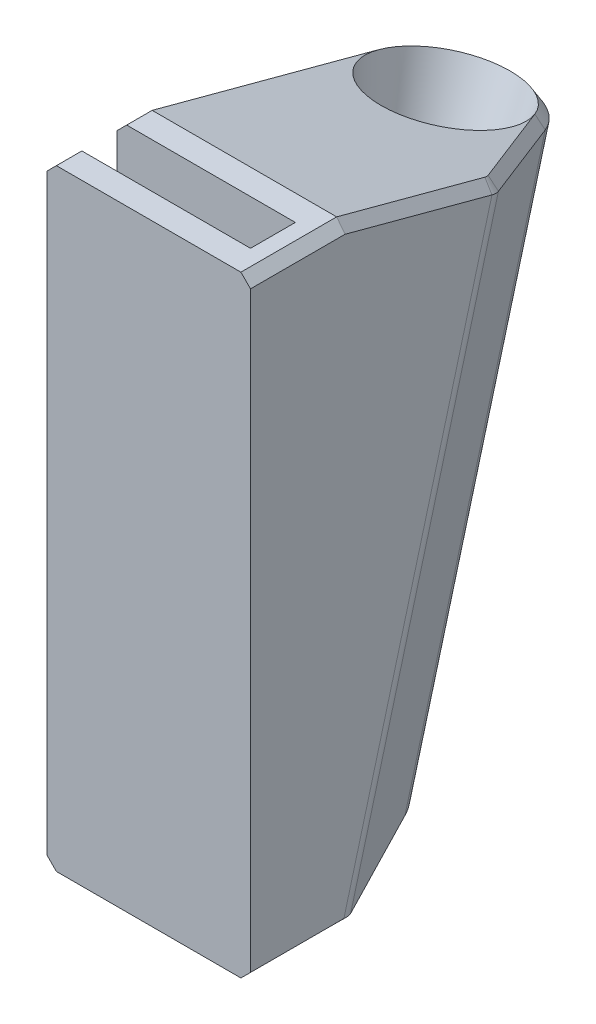
ISO-10303-21;
HEADER;
FILE_DESCRIPTION(('STEP AP214'),'2;1');
FILE_NAME('part.step','',(''),(''),'','','');
FILE_SCHEMA(('AUTOMOTIVE_DESIGN { 1 0 10303 214 1 1 1 1 }'));
ENDSEC;
DATA;
#1=APPLICATION_CONTEXT('core data for automotive mechanical design processes');
#2=APPLICATION_PROTOCOL_DEFINITION('international standard','automotive_design',2000,#1);
#3=PRODUCT_CONTEXT('',#1,'mechanical');
#4=PRODUCT('Part','Part','',(#3));
#5=PRODUCT_RELATED_PRODUCT_CATEGORY('part','',(#4));
#6=PRODUCT_DEFINITION_FORMATION('','',#4);
#7=PRODUCT_DEFINITION_CONTEXT('part definition',#1,'design');
#8=PRODUCT_DEFINITION('design','',#6,#7);
#9=PRODUCT_DEFINITION_SHAPE('','',#8);
#10=(LENGTH_UNIT() NAMED_UNIT(*) SI_UNIT(.MILLI.,.METRE.));
#11=(NAMED_UNIT(*) PLANE_ANGLE_UNIT() SI_UNIT($,.RADIAN.));
#12=(NAMED_UNIT(*) SI_UNIT($,.STERADIAN.) SOLID_ANGLE_UNIT());
#13=UNCERTAINTY_MEASURE_WITH_UNIT(LENGTH_MEASURE(1.E-05),#10,'distance_accuracy_value','');
#14=(GEOMETRIC_REPRESENTATION_CONTEXT(3) GLOBAL_UNCERTAINTY_ASSIGNED_CONTEXT((#13)) GLOBAL_UNIT_ASSIGNED_CONTEXT((#10,
#11,#12)) REPRESENTATION_CONTEXT('',''));
#15=CARTESIAN_POINT('',(0.,0.,0.));
#16=DIRECTION('',(0.,0.,1.));
#17=DIRECTION('',(1.,0.,0.));
#18=AXIS2_PLACEMENT_3D('',#15,#16,#17);
#19=CARTESIAN_POINT('',(3.175,0.,-8.763));
#20=DIRECTION('',(0.,-1.,0.));
#21=DIRECTION('',(0.,0.,-1.));
#22=AXIS2_PLACEMENT_3D('',#19,#20,#21);
#23=PLANE('',#22);
#24=DIRECTION('',(-1.,0.,0.));
#25=VECTOR('',#24,1.);
#26=CARTESIAN_POINT('',(0.,0.,0.));
#27=LINE('',#26,#25);
#28=CARTESIAN_POINT('',(0.,0.,0.));
#29=VERTEX_POINT('',#28);
#30=CARTESIAN_POINT('',(-21.025000114,0.,0.));
#31=VERTEX_POINT('',#30);
#32=EDGE_CURVE('E208',#29,#31,#27,.T.);
#33=ORIENTED_EDGE('',*,*,#32,.F.);
#34=DIRECTION('',(0.,0.,1.));
#35=VECTOR('',#34,1.);
#36=CARTESIAN_POINT('',(0.,0.,-5.588));
#37=LINE('',#36,#35);
#38=CARTESIAN_POINT('',(0.,0.,-5.588));
#39=VERTEX_POINT('',#38);
#40=EDGE_CURVE('E184',#39,#29,#37,.T.);
#41=ORIENTED_EDGE('',*,*,#40,.F.);
#42=DIRECTION('',(-1.,0.,0.));
#43=VECTOR('',#42,1.);
#44=CARTESIAN_POINT('',(0.,0.,-5.588));
#45=LINE('',#44,#43);
#46=CARTESIAN_POINT('',(-21.025000114,0.,-5.588));
#47=VERTEX_POINT('',#46);
#48=EDGE_CURVE('E339',#39,#47,#45,.T.);
#49=ORIENTED_EDGE('',*,*,#48,.T.);
#50=DIRECTION('',(0.,0.,1.));
#51=VECTOR('',#50,1.);
#52=CARTESIAN_POINT('',(-21.025000114,0.,-5.588));
#53=LINE('',#52,#51);
#54=CARTESIAN_POINT('',(-21.025000114,0.,-18.9455446187771));
#55=VERTEX_POINT('',#54);
#56=EDGE_CURVE('E275',#55,#47,#53,.T.);
#57=ORIENTED_EDGE('',*,*,#56,.F.);
#58=CARTESIAN_POINT('',(-5.35441166411764,0.,-23.0013913575703));
#59=CARTESIAN_POINT('',(-5.57081605958401,0.,-23.421504234523));
#60=CARTESIAN_POINT('',(-5.82095043061329,0.,-23.8229818477441));
#61=CARTESIAN_POINT('',(-6.38174736810887,0.,-24.5777527959422));
#62=CARTESIAN_POINT('',(-6.69241459708046,0.,-24.9310211683825));
#63=CARTESIAN_POINT('',(-7.36579941339964,0.,-25.57967272119));
#64=CARTESIAN_POINT('',(-7.72850283692149,0.,-25.8750422579692));
#65=CARTESIAN_POINT('',(-8.49602296852115,0.,-26.3997996100877));
#66=CARTESIAN_POINT('',(-8.90082353271069,0.,-26.6291763877732));
#67=CARTESIAN_POINT('',(-9.74144685403974,0.,-27.0156597697813));
#68=CARTESIAN_POINT('',(-10.1772519296105,0.,-27.172758244862));
#69=CARTESIAN_POINT('',(-11.0679430901812,0.,-27.4103769677549));
#70=CARTESIAN_POINT('',(-11.5228104404592,0.,-27.4908922175166));
#71=CARTESIAN_POINT('',(-12.4391620956955,0.,-27.5731348862036));
#72=CARTESIAN_POINT('',(-12.9006271261731,0.,-27.5748605752424));
#73=CARTESIAN_POINT('',(-13.8175287646052,0.,-27.4994735183686));
#74=CARTESIAN_POINT('',(-14.2729460865103,0.,-27.4223623581419));
#75=CARTESIAN_POINT('',(-15.1652721256428,0.,-27.1914113847735));
#76=CARTESIAN_POINT('',(-15.6021620737591,0.,-27.0375764294337));
#77=CARTESIAN_POINT('',(-16.4454603689255,0.,-26.6573902203071));
#78=CARTESIAN_POINT('',(-16.85185097814,0.,-26.4310469633091));
#79=CARTESIAN_POINT('',(-17.6230128773411,0.,-25.9120436478765));
#80=CARTESIAN_POINT('',(-17.9877679468373,0.,-25.6193945060674));
#81=CARTESIAN_POINT('',(-18.665661530249,0.,-24.9757961775968));
#82=CARTESIAN_POINT('',(-18.9787857855008,0.,-24.6248605282362));
#83=CARTESIAN_POINT('',(-19.5448349371783,0.,-23.8743035200246));
#84=CARTESIAN_POINT('',(-19.7977479274817,0.,-23.474697948179));
#85=CARTESIAN_POINT('',(-20.2364413711305,0.,-22.6377495503634));
#86=CARTESIAN_POINT('',(-20.4222125971395,0.,-22.200424328491));
#87=CARTESIAN_POINT('',(-20.7215289469979,0.,-21.3000191887223));
#88=CARTESIAN_POINT('',(-20.8350677751351,0.,-20.8369582096183));
#89=CARTESIAN_POINT('',(-20.9868049544269,0.,-19.8977698617436));
#90=CARTESIAN_POINT('',(-21.0250187663792,0.,-19.4216622471294));
#91=CARTESIAN_POINT('',(-21.025000114,0.,-18.9455446187771));
#92=B_SPLINE_CURVE_WITH_KNOTS('',3,(#58,#59,#60,#61,#62,#63,#64,#65,#66,#67,#68,#69,#70,#71,#72,
#73,#74,#75,#76,#77,#78,#79,#80,#81,#82,#83,#84,#85,#86,#87,#88,#89,#90,#91),.UNSPECIFIED.,.F.,
.F.,(4,2,2,2,2,2,2,2,2,2,2,2,2,2,2,2,4),(-1.08083900054117,-0.915111792582664,-0.74938458462416,
-0.583657376665656,-0.417930168707152,-0.252202960748648,-0.0864757527901437,0.0792514551683604,
0.244978663126864,0.410705871085368,0.576433079043873,0.742160287002377,0.907887494960881,
1.07361470291938,1.23934191087789,1.40506911883639,1.5707963267949),.UNSPECIFIED.);
#93=CARTESIAN_POINT('',(-5.35441166411764,0.,-23.0013913575703));
#94=VERTEX_POINT('',#93);
#95=EDGE_CURVE('E284',#94,#55,#92,.T.);
#96=ORIENTED_EDGE('',*,*,#95,.F.);
#97=DIRECTION('',(-0.45796286014196,0.,-0.888971326157709));
#98=VECTOR('',#97,1.);
#99=CARTESIAN_POINT('',(-5.23945173486324,0.,-22.7782377142102));
#100=LINE('',#99,#98);
#101=CARTESIAN_POINT('',(1.83382362694119,0.,-9.04799990253968));
#102=VERTEX_POINT('',#101);
#103=EDGE_CURVE('E363',#102,#94,#100,.T.);
#104=ORIENTED_EDGE('',*,*,#103,.F.);
#105=CARTESIAN_POINT('',(1.97500011400001,0.,-8.46337328539579));
#106=CARTESIAN_POINT('',(1.97501290795025,0.,-8.5648228997755));
#107=CARTESIAN_POINT('',(1.96293785581164,0.,-8.66626236382779));
#108=CARTESIAN_POINT('',(1.91540436417708,0.,-8.86310353047173));
#109=CARTESIAN_POINT('',(1.87994917576619,0.,-8.95849176997966));
#110=CARTESIAN_POINT('',(1.83382362694119,0.,-9.04799990253968));
#111=B_SPLINE_CURVE_WITH_KNOTS('',3,(#105,#106,#107,#108,#109,#110),.UNSPECIFIED.,.F.,.F.,(4,2,
4),(1.5707963267949,1.81577498992176,2.06075365304862),.UNSPECIFIED.);
#112=CARTESIAN_POINT('',(1.97500011400001,0.,-8.46337328539579));
#113=VERTEX_POINT('',#112);
#114=EDGE_CURVE('E356',#113,#102,#111,.T.);
#115=ORIENTED_EDGE('',*,*,#114,.F.);
#116=DIRECTION('',(0.,0.,-1.));
#117=VECTOR('',#116,1.);
#118=CARTESIAN_POINT('',(1.97500011400001,0.,-8.14183428502466));
#119=LINE('',#118,#117);
#120=CARTESIAN_POINT('',(1.97500011400001,0.,3.175));
#121=VERTEX_POINT('',#120);
#122=EDGE_CURVE('E353',#121,#113,#119,.T.);
#123=ORIENTED_EDGE('',*,*,#122,.F.);
#124=DIRECTION('',(-1.,0.,0.));
#125=VECTOR('',#124,1.);
#126=CARTESIAN_POINT('',(3.175,0.,3.175));
#127=LINE('',#126,#125);
#128=CARTESIAN_POINT('',(-21.025000114,0.,3.175));
#129=VERTEX_POINT('',#128);
#130=EDGE_CURVE('E337',#121,#129,#127,.T.);
#131=ORIENTED_EDGE('',*,*,#130,.T.);
#132=DIRECTION('',(0.,0.,1.));
#133=VECTOR('',#132,1.);
#134=CARTESIAN_POINT('',(-21.025000114,0.,3.175));
#135=LINE('',#134,#133);
#136=EDGE_CURVE('E283',#31,#129,#135,.T.);
#137=ORIENTED_EDGE('',*,*,#136,.F.);
#138=EDGE_LOOP('',(#33,#41,#49,#57,#96,#104,#115,#123,#131,#137));
#139=FACE_BOUND('',#138,.T.);
#140=ADVANCED_FACE('F43',(#139),#23,.T.);
#141=CARTESIAN_POINT('',(-4.29558823529412,67.4701981715382,-41.3430639638281));
#142=DIRECTION('',(-0.882352941176471,0.121797197695301,0.454553330018386));
#143=DIRECTION('',(-0.45796286014196,0.,-0.888971326157709));
#144=AXIS2_PLACEMENT_3D('',#141,#142,#143);
#145=PLANE('',#144);
#146=DIRECTION('',(0.,-0.96592582628907,0.258819045102514));
#147=VECTOR('',#146,1.);
#148=CARTESIAN_POINT('',(-4.29558823529412,67.4701981715382,-41.3430639638281));
#149=LINE('',#148,#147);
#150=CARTESIAN_POINT('',(-4.29558823529412,66.3110872901068,-41.0324811392104));
#151=VERTEX_POINT('',#150);
#152=CARTESIAN_POINT('',(-4.29558823529412,1.0538432626505,-23.5468553017733));
#153=VERTEX_POINT('',#152);
#154=EDGE_CURVE('E188',#151,#153,#149,.T.);
#155=ORIENTED_EDGE('',*,*,#154,.F.);
#156=DIRECTION('',(-0.470588235294118,-0.228369745678689,-0.852287493784474));
#157=VECTOR('',#156,1.);
#158=CARTESIAN_POINT('',(-4.29558823529413,66.3110872901068,-41.0324811392104));
#159=LINE('',#158,#157);
#160=CARTESIAN_POINT('',(2.89264705576471,69.7994351538644,-28.0137896771924));
#161=VERTEX_POINT('',#160);
#162=EDGE_CURVE('E618',#161,#151,#159,.T.);
#163=ORIENTED_EDGE('',*,*,#162,.F.);
#164=DIRECTION('',(0.,-0.96592582628907,0.258819045102514));
#165=VECTOR('',#164,1.);
#166=CARTESIAN_POINT('',(2.89264705576471,70.9585460352958,-28.3243725018101));
#167=LINE('',#166,#165);
#168=CARTESIAN_POINT('',(2.89264705576471,1.05384326265052,-9.59346384674265));
#169=VERTEX_POINT('',#168);
#170=EDGE_CURVE('E238',#169,#161,#167,.F.);
#171=ORIENTED_EDGE('',*,*,#170,.F.);
#172=DIRECTION('',(0.45796286014196,0.,0.888971326157709));
#173=VECTOR('',#172,1.);
#174=CARTESIAN_POINT('',(3.0076069850191,1.05384326265053,-9.37031020338258));
#175=LINE('',#174,#173);
#176=EDGE_CURVE('E601',#153,#169,#175,.T.);
#177=ORIENTED_EDGE('',*,*,#176,.F.);
#178=EDGE_LOOP('',(#155,#163,#171,#177));
#179=FACE_BOUND('',#178,.T.);
#180=ADVANCED_FACE('F252',(#179),#145,.F.);
#181=CARTESIAN_POINT('',(-12.7,-26.4817761526506,-11.5282350841617));
#182=DIRECTION('',(0.,0.96592582628907,-0.258819045102514));
#183=DIRECTION('',(0.,0.258819045102514,0.96592582628907));
#184=AXIS2_PLACEMENT_3D('',#181,#182,#183);
#185=CYLINDRICAL_SURFACE('',#184,9.52500000000001);
#186=DIRECTION('',(0.,-0.96592582628907,0.258819045102514));
#187=VECTOR('',#186,1.);
#188=CARTESIAN_POINT('',(-22.225,68.6303164795859,-37.0134434954029));
#189=LINE('',#188,#187);
#190=CARTESIAN_POINT('',(-22.225,67.4712055981546,-36.7028606707853));
#191=VERTEX_POINT('',#190);
#192=CARTESIAN_POINT('',(-22.225,1.19999988600002,-18.9455446187771));
#193=VERTEX_POINT('',#192);
#194=EDGE_CURVE('E221',#191,#193,#189,.T.);
#195=ORIENTED_EDGE('',*,*,#194,.F.);
#196=CARTESIAN_POINT('',(-12.7,67.4712055981546,-36.7028606707853));
#197=DIRECTION('',(0.,-0.965925826289071,0.258819045102512));
#198=DIRECTION('',(0.,0.258819045102512,0.965925826289071));
#199=AXIS2_PLACEMENT_3D('',#196,#197,#198);
#200=CIRCLE('',#199,9.52500000000001);
#201=EDGE_CURVE('E224',#151,#191,#200,.F.);
#202=ORIENTED_EDGE('',*,*,#201,.F.);
#203=ORIENTED_EDGE('',*,*,#154,.T.);
#204=CARTESIAN_POINT('',(-22.225,1.19999988600001,-18.9455446187771));
#205=CARTESIAN_POINT('',(-22.2250213410101,1.18284249585221,-19.4856944988863));
#206=CARTESIAN_POINT('',(-22.1812992324392,1.16568546656,-20.0258330185204));
#207=CARTESIAN_POINT('',(-22.0076900296788,1.13184084508967,-21.0913312132963));
#208=CARTESIAN_POINT('',(-21.8777852461143,1.11515396477392,-21.6166684775485));
#209=CARTESIAN_POINT('',(-21.5353242018633,1.08270693623664,-22.638167576382));
#210=CARTESIAN_POINT('',(-21.3227751443888,1.066947470495,-23.1343079250948));
#211=CARTESIAN_POINT('',(-20.8208466166332,1.03678717114904,-24.0838160924471));
#212=CARTESIAN_POINT('',(-20.5314777037651,1.02238697192717,-24.5371639394234));
#213=CARTESIAN_POINT('',(-19.8838358904418,0.995339875471933,-25.3886620858059));
#214=CARTESIAN_POINT('',(-19.5255766123127,0.982693547139846,-25.7867944750299));
#215=CARTESIAN_POINT('',(-18.7499686491208,0.959500817103278,-26.5169492503628));
#216=CARTESIAN_POINT('',(-18.3326362780221,0.948954903229347,-26.8489562785632));
#217=CARTESIAN_POINT('',(-17.4503159189509,0.930252083084564,-27.4377594690183));
#218=CARTESIAN_POINT('',(-16.9853464895434,0.922095570205328,-27.6945432464973));
#219=CARTESIAN_POINT('',(-16.0204916965833,0.908395167762103,-28.1258600536226));
#220=CARTESIAN_POINT('',(-15.520626627645,0.902851566370323,-28.3003840110166));
#221=CARTESIAN_POINT('',(-14.4996770292972,0.894529009676172,-28.5623951888136));
#222=CARTESIAN_POINT('',(-13.9786139744195,0.891750229429423,-28.6498768981062));
#223=CARTESIAN_POINT('',(-12.9295463484313,0.889033579026591,-28.7354026323088));
#224=CARTESIAN_POINT('',(-12.4015638432987,0.889095766012222,-28.7334448582799));
#225=CARTESIAN_POINT('',(-11.3531254773546,0.892059465462555,-28.6401415126671));
#226=CARTESIAN_POINT('',(-10.832691669285,0.894960915589121,-28.5487979036154));
#227=CARTESIAN_POINT('',(-9.81361260764431,0.90352375151929,-28.2792222419771));
#228=CARTESIAN_POINT('',(-9.31498878925937,0.909184957213284,-28.1009958596112));
#229=CARTESIAN_POINT('',(-8.35319455190881,0.923112284780716,-27.6625349835112));
#230=CARTESIAN_POINT('',(-7.8900443631809,0.93137811370889,-27.4023097122961));
#231=CARTESIAN_POINT('',(-7.01189071112789,0.950288286504489,-26.806978634527));
#232=CARTESIAN_POINT('',(-6.59690571872464,0.960932232618939,-26.4718853500542));
#233=CARTESIAN_POINT('',(-5.82645643492819,0.984307060810029,-25.7359977508198));
#234=CARTESIAN_POINT('',(-5.47100834899123,0.997037451225926,-25.3352189145483));
#235=CARTESIAN_POINT('',(-4.82937582568565,1.02423640135789,-24.4789401025425));
#236=CARTESIAN_POINT('',(-4.54318605374349,1.038704061523,-24.0234684465199));
#237=CARTESIAN_POINT('',(-4.29558823529412,1.05384326265052,-23.5468553017733));
#238=B_SPLINE_CURVE_WITH_KNOTS('',3,(#204,#205,#206,#207,#208,#209,#210,#211,#212,#213,#214,
#215,#216,#217,#218,#219,#220,#221,#222,#223,#224,#225,#226,#227,#228,#229,#230,#231,#232,#233,
#234,#235,#236,#237),.UNSPECIFIED.,.F.,.F.,(4,2,2,2,2,2,2,2,2,2,2,2,2,2,2,2,4),
(-1.08083900054117,-0.915111792582664,-0.74938458462416,-0.583657376665656,-0.417930168707152,
-0.252202960748648,-0.0864757527901436,0.0792514551683604,0.244978663126864,0.410705871085368,
0.576433079043873,0.742160287002377,0.907887494960881,1.07361470291938,1.23934191087789,
1.40506911883639,1.5707963267949),.UNSPECIFIED.);
#239=EDGE_CURVE('E227',#193,#153,#238,.T.);
#240=ORIENTED_EDGE('',*,*,#239,.F.);
#241=EDGE_LOOP('',(#195,#202,#203,#240));
#242=FACE_BOUND('',#241,.T.);
#243=ADVANCED_FACE('F241',(#242),#185,.T.);
#244=CARTESIAN_POINT('',(-22.225,79.1844999999999,2.37530563518935));
#245=DIRECTION('',(1.,0.,0.));
#246=DIRECTION('',(0.,0.,1.));
#247=AXIS2_PLACEMENT_3D('',#244,#245,#246);
#248=PLANE('',#247);
#249=DIRECTION('',(0.,1.,0.));
#250=VECTOR('',#249,1.);
#251=CARTESIAN_POINT('',(-22.225,76.2,-5.588));
#252=LINE('',#251,#250);
#253=CARTESIAN_POINT('',(-22.225,1.19999988600003,-5.588));
#254=VERTEX_POINT('',#253);
#255=CARTESIAN_POINT('',(-22.225,75.000000114,-5.588));
#256=VERTEX_POINT('',#255);
#257=EDGE_CURVE('E325',#254,#256,#252,.T.);
#258=ORIENTED_EDGE('',*,*,#257,.T.);
#259=DIRECTION('',(0.,0.,1.));
#260=VECTOR('',#259,1.);
#261=CARTESIAN_POINT('',(-22.225,75.000000114,-5.588));
#262=LINE('',#261,#260);
#263=CARTESIAN_POINT('',(-22.225,75.000000114,-8.60501701790354));
#264=VERTEX_POINT('',#263);
#265=EDGE_CURVE('E304',#264,#256,#262,.T.);
#266=ORIENTED_EDGE('',*,*,#265,.F.);
#267=DIRECTION('',(0.,0.258819045102514,0.96592582628907));
#268=VECTOR('',#267,1.);
#269=CARTESIAN_POINT('',(-22.225,75.0408891185687,-8.45241717538235));
#270=LINE('',#269,#268);
#271=EDGE_CURVE('E299',#191,#264,#270,.T.);
#272=ORIENTED_EDGE('',*,*,#271,.F.);
#273=ORIENTED_EDGE('',*,*,#194,.T.);
#274=DIRECTION('',(0.,0.,-1.));
#275=VECTOR('',#274,1.);
#276=CARTESIAN_POINT('',(-22.225,1.199999886,-18.624005618406));
#277=LINE('',#276,#275);
#278=EDGE_CURVE('E307',#254,#193,#277,.T.);
#279=ORIENTED_EDGE('',*,*,#278,.F.);
#280=EDGE_LOOP('',(#258,#266,#272,#273,#279));
#281=FACE_BOUND('',#280,.T.);
#282=ADVANCED_FACE('F251',(#281),#248,.F.);
#283=CARTESIAN_POINT('',(3.175,71.0955678841874,-27.8129999999995));
#284=DIRECTION('',(-1.,0.,0.));
#285=DIRECTION('',(0.,0.,-1.));
#286=AXIS2_PLACEMENT_3D('',#283,#284,#285);
#287=PLANE('',#286);
#288=DIRECTION('',(0.,-0.96592582628907,0.258819045102514));
#289=VECTOR('',#288,1.);
#290=CARTESIAN_POINT('',(3.175,71.2508593129312,-27.2334444979476));
#291=LINE('',#290,#289);
#292=CARTESIAN_POINT('',(3.175,70.0917484314999,-26.9228616733299));
#293=VERTEX_POINT('',#292);
#294=CARTESIAN_POINT('',(3.175,1.199999886,-8.46337328539579));
#295=VERTEX_POINT('',#294);
#296=EDGE_CURVE('E602',#293,#295,#291,.T.);
#297=ORIENTED_EDGE('',*,*,#296,.F.);
#298=DIRECTION('',(0.,-0.258819045102514,-0.96592582628907));
#299=VECTOR('',#298,1.);
#300=CARTESIAN_POINT('',(3.175,70.0917484314999,-26.9228616733299));
#301=LINE('',#300,#299);
#302=CARTESIAN_POINT('',(3.175,75.000000114,-8.60501701790355));
#303=VERTEX_POINT('',#302);
#304=EDGE_CURVE('E581',#303,#293,#301,.T.);
#305=ORIENTED_EDGE('',*,*,#304,.F.);
#306=DIRECTION('',(0.,0.,-1.));
#307=VECTOR('',#306,1.);
#308=CARTESIAN_POINT('',(3.175,75.000000114,-8.76300000000001));
#309=LINE('',#308,#307);
#310=CARTESIAN_POINT('',(3.175,75.000000114,3.175));
#311=VERTEX_POINT('',#310);
#312=EDGE_CURVE('E575',#311,#303,#309,.T.);
#313=ORIENTED_EDGE('',*,*,#312,.F.);
#314=DIRECTION('',(0.,-1.,0.));
#315=VECTOR('',#314,1.);
#316=CARTESIAN_POINT('',(3.175,76.2,3.175));
#317=LINE('',#316,#315);
#318=CARTESIAN_POINT('',(3.175,1.19999988600003,3.175));
#319=VERTEX_POINT('',#318);
#320=EDGE_CURVE('E331',#311,#319,#317,.T.);
#321=ORIENTED_EDGE('',*,*,#320,.T.);
#322=DIRECTION('',(0.,0.,1.));
#323=VECTOR('',#322,1.);
#324=CARTESIAN_POINT('',(3.175,1.199999886,3.175));
#325=LINE('',#324,#323);
#326=EDGE_CURVE('E391',#295,#319,#325,.T.);
#327=ORIENTED_EDGE('',*,*,#326,.F.);
#328=EDGE_LOOP('',(#297,#305,#313,#321,#327));
#329=FACE_BOUND('',#328,.T.);
#330=ADVANCED_FACE('F253',(#329),#287,.F.);
#331=CARTESIAN_POINT('',(-12.7,68.6303164795859,-37.0134434954029));
#332=DIRECTION('',(0.,0.96592582628907,-0.258819045102514));
#333=DIRECTION('',(0.,0.258819045102514,0.96592582628907));
#334=AXIS2_PLACEMENT_3D('',#331,#332,#333);
#335=PLANE('',#334);
#336=DIRECTION('',(0.,-0.258819045102514,-0.96592582628907));
#337=VECTOR('',#336,1.);
#338=CARTESIAN_POINT('',(-21.025000114,68.6303164795859,-37.0134434954029));
#339=LINE('',#338,#337);
#340=CARTESIAN_POINT('',(-21.025000114,76.2,-8.763));
#341=VERTEX_POINT('',#340);
#342=CARTESIAN_POINT('',(-21.025000114,68.6303164795859,-37.0134434954029));
#343=VERTEX_POINT('',#342);
#344=EDGE_CURVE('E404',#341,#343,#339,.T.);
#345=ORIENTED_EDGE('',*,*,#344,.F.);
#346=DIRECTION('',(-1.,0.,0.));
#347=VECTOR('',#346,1.);
#348=CARTESIAN_POINT('',(-12.7,76.2,-8.763));
#349=LINE('',#348,#347);
#350=CARTESIAN_POINT('',(1.97500011400001,76.2,-8.763));
#351=VERTEX_POINT('',#350);
#352=EDGE_CURVE('E301',#351,#341,#349,.T.);
#353=ORIENTED_EDGE('',*,*,#352,.F.);
#354=DIRECTION('',(0.,0.258819045102514,0.96592582628907));
#355=VECTOR('',#354,1.);
#356=CARTESIAN_POINT('',(1.97500011400001,76.2,-8.76300000000001));
#357=LINE('',#356,#355);
#358=CARTESIAN_POINT('',(1.97500011400001,71.2508593129312,-27.2334444979476));
#359=VERTEX_POINT('',#358);
#360=EDGE_CURVE('E389',#359,#351,#357,.T.);
#361=ORIENTED_EDGE('',*,*,#360,.F.);
#362=CARTESIAN_POINT('',(0.774999973999998,71.2508593129312,-27.2334444979476));
#363=DIRECTION('',(0.,-0.96592582628907,0.258819045102514));
#364=DIRECTION('',(0.,0.258819045102514,0.96592582628907));
#365=AXIS2_PLACEMENT_3D('',#362,#363,#364);
#366=CIRCLE('',#365,1.20000014000002);
#367=CARTESIAN_POINT('',(1.83382362694119,71.1047026586452,-27.7789085576071));
#368=VERTEX_POINT('',#367);
#369=EDGE_CURVE('E397',#368,#359,#366,.T.);
#370=ORIENTED_EDGE('',*,*,#369,.F.);
#371=DIRECTION('',(0.470588235294118,0.228369745678689,0.852287493784474));
#372=VECTOR('',#371,1.);
#373=CARTESIAN_POINT('',(1.83382362694119,71.1047026586452,-27.7789085576071));
#374=LINE('',#373,#372);
#375=CARTESIAN_POINT('',(-5.35441166411764,67.6163547948877,-40.7976000196251));
#376=VERTEX_POINT('',#375);
#377=EDGE_CURVE('E400',#376,#368,#374,.T.);
#378=ORIENTED_EDGE('',*,*,#377,.F.);
#379=CARTESIAN_POINT('',(-12.7,68.6303164795859,-37.0134434954029));
#380=DIRECTION('',(0.,-0.96592582628907,0.258819045102514));
#381=DIRECTION('',(0.,0.258819045102514,0.96592582628907));
#382=AXIS2_PLACEMENT_3D('',#379,#380,#381);
#383=CIRCLE('',#382,8.32500011399986);
#384=EDGE_CURVE('E11',#343,#376,#383,.F.);
#385=ORIENTED_EDGE('',*,*,#384,.F.);
#386=EDGE_LOOP('',(#345,#353,#361,#370,#378,#385));
#387=FACE_BOUND('',#386,.T.);
#388=ADVANCED_FACE('F627',(#387),#335,.T.);
#389=CARTESIAN_POINT('',(0.,0.,3.175));
#390=DIRECTION('',(0.,0.,1.));
#391=DIRECTION('',(-1.,0.,0.));
#392=AXIS2_PLACEMENT_3D('',#389,#390,#391);
#393=PLANE('',#392);
#394=ORIENTED_EDGE('',*,*,#130,.F.);
#395=DIRECTION('',(-0.707106781186543,-0.707106781186552,0.));
#396=VECTOR('',#395,1.);
#397=CARTESIAN_POINT('',(0.987500057000016,-0.987500057000004,3.175));
#398=LINE('',#397,#396);
#399=EDGE_CURVE('E294',#319,#121,#398,.T.);
#400=ORIENTED_EDGE('',*,*,#399,.F.);
#401=ORIENTED_EDGE('',*,*,#320,.F.);
#402=DIRECTION('',(0.707106781186547,-0.707106781186548,0.));
#403=VECTOR('',#402,1.);
#404=CARTESIAN_POINT('',(39.087500057,39.087500057,3.175));
#405=LINE('',#404,#403);
#406=CARTESIAN_POINT('',(1.97500011400001,76.2,3.175));
#407=VERTEX_POINT('',#406);
#408=EDGE_CURVE('E289',#407,#311,#405,.T.);
#409=ORIENTED_EDGE('',*,*,#408,.F.);
#410=DIRECTION('',(1.,0.,0.));
#411=VECTOR('',#410,1.);
#412=CARTESIAN_POINT('',(3.175,76.2,3.175));
#413=LINE('',#412,#411);
#414=CARTESIAN_POINT('',(-21.025000114,76.2,3.175));
#415=VERTEX_POINT('',#414);
#416=EDGE_CURVE('E328',#415,#407,#413,.T.);
#417=ORIENTED_EDGE('',*,*,#416,.F.);
#418=DIRECTION('',(0.707106781186548,0.707106781186547,0.));
#419=VECTOR('',#418,1.);
#420=CARTESIAN_POINT('',(-48.612500057,48.612500057,3.175));
#421=LINE('',#420,#419);
#422=CARTESIAN_POINT('',(-22.225,75.000000114,3.175));
#423=VERTEX_POINT('',#422);
#424=EDGE_CURVE('E291',#423,#415,#421,.T.);
#425=ORIENTED_EDGE('',*,*,#424,.F.);
#426=DIRECTION('',(0.,1.,0.));
#427=VECTOR('',#426,1.);
#428=CARTESIAN_POINT('',(-22.225,76.2,3.175));
#429=LINE('',#428,#427);
#430=CARTESIAN_POINT('',(-22.225,1.19999988600003,3.175));
#431=VERTEX_POINT('',#430);
#432=EDGE_CURVE('E329',#431,#423,#429,.T.);
#433=ORIENTED_EDGE('',*,*,#432,.F.);
#434=DIRECTION('',(-0.707106781186546,0.707106781186549,0.));
#435=VECTOR('',#434,1.);
#436=CARTESIAN_POINT('',(-10.5125000570001,-10.512500057,3.175));
#437=LINE('',#436,#435);
#438=EDGE_CURVE('E296',#129,#431,#437,.T.);
#439=ORIENTED_EDGE('',*,*,#438,.F.);
#440=EDGE_LOOP('',(#394,#400,#401,#409,#417,#425,#433,#439));
#441=FACE_BOUND('',#440,.T.);
#442=ADVANCED_FACE('F578',(#441),#393,.T.);
#443=CARTESIAN_POINT('',(3.175,76.2,-8.763));
#444=DIRECTION('',(0.,1.,0.));
#445=DIRECTION('',(0.,0.,1.));
#446=AXIS2_PLACEMENT_3D('',#443,#444,#445);
#447=PLANE('',#446);
#448=ORIENTED_EDGE('',*,*,#416,.T.);
#449=DIRECTION('',(0.,0.,1.));
#450=VECTOR('',#449,1.);
#451=CARTESIAN_POINT('',(1.97500011400001,76.2,3.175));
#452=LINE('',#451,#450);
#453=EDGE_CURVE('E387',#351,#407,#452,.T.);
#454=ORIENTED_EDGE('',*,*,#453,.F.);
#455=ORIENTED_EDGE('',*,*,#352,.T.);
#456=DIRECTION('',(0.,0.,-1.));
#457=VECTOR('',#456,1.);
#458=CARTESIAN_POINT('',(-21.025000114,76.2,-8.763));
#459=LINE('',#458,#457);
#460=CARTESIAN_POINT('',(-21.025000114,76.2,-5.588));
#461=VERTEX_POINT('',#460);
#462=EDGE_CURVE('E382',#461,#341,#459,.T.);
#463=ORIENTED_EDGE('',*,*,#462,.F.);
#464=DIRECTION('',(1.,0.,0.));
#465=VECTOR('',#464,1.);
#466=CARTESIAN_POINT('',(0.,76.2,-5.588));
#467=LINE('',#466,#465);
#468=CARTESIAN_POINT('',(0.,76.2,-5.588));
#469=VERTEX_POINT('',#468);
#470=EDGE_CURVE('E204',#461,#469,#467,.T.);
#471=ORIENTED_EDGE('',*,*,#470,.T.);
#472=DIRECTION('',(0.,0.,1.));
#473=VECTOR('',#472,1.);
#474=CARTESIAN_POINT('',(0.,76.2,-5.588));
#475=LINE('',#474,#473);
#476=CARTESIAN_POINT('',(0.,76.2,0.));
#477=VERTEX_POINT('',#476);
#478=EDGE_CURVE('E181',#469,#477,#475,.T.);
#479=ORIENTED_EDGE('',*,*,#478,.T.);
#480=DIRECTION('',(1.,0.,0.));
#481=VECTOR('',#480,1.);
#482=CARTESIAN_POINT('',(0.,76.2,0.));
#483=LINE('',#482,#481);
#484=CARTESIAN_POINT('',(-21.025000114,76.2,0.));
#485=VERTEX_POINT('',#484);
#486=EDGE_CURVE('E189',#485,#477,#483,.T.);
#487=ORIENTED_EDGE('',*,*,#486,.F.);
#488=DIRECTION('',(0.,0.,-1.));
#489=VECTOR('',#488,1.);
#490=CARTESIAN_POINT('',(-21.025000114,76.2,0.));
#491=LINE('',#490,#489);
#492=EDGE_CURVE('E386',#415,#485,#491,.T.);
#493=ORIENTED_EDGE('',*,*,#492,.F.);
#494=EDGE_LOOP('',(#448,#454,#455,#463,#471,#479,#487,#493));
#495=FACE_BOUND('',#494,.T.);
#496=ADVANCED_FACE('F201',(#495),#447,.T.);
#497=CARTESIAN_POINT('',(0.,76.2,-5.588));
#498=DIRECTION('',(1.,0.,0.));
#499=DIRECTION('',(0.,-1.,0.));
#500=AXIS2_PLACEMENT_3D('',#497,#498,#499);
#501=PLANE('',#500);
#502=DIRECTION('',(0.,-1.,0.));
#503=VECTOR('',#502,1.);
#504=CARTESIAN_POINT('',(0.,76.2,0.));
#505=LINE('',#504,#503);
#506=EDGE_CURVE('E177',#477,#29,#505,.T.);
#507=ORIENTED_EDGE('',*,*,#506,.F.);
#508=ORIENTED_EDGE('',*,*,#478,.F.);
#509=DIRECTION('',(0.,-1.,0.));
#510=VECTOR('',#509,1.);
#511=CARTESIAN_POINT('',(0.,76.2,-5.588));
#512=LINE('',#511,#510);
#513=EDGE_CURVE('E198',#469,#39,#512,.T.);
#514=ORIENTED_EDGE('',*,*,#513,.T.);
#515=ORIENTED_EDGE('',*,*,#40,.T.);
#516=EDGE_LOOP('',(#507,#508,#514,#515));
#517=FACE_BOUND('',#516,.T.);
#518=ADVANCED_FACE('F179',(#517),#501,.F.);
#519=CARTESIAN_POINT('',(0.,0.,-5.588));
#520=DIRECTION('',(0.,0.,1.));
#521=DIRECTION('',(-1.,0.,0.));
#522=AXIS2_PLACEMENT_3D('',#519,#520,#521);
#523=PLANE('',#522);
#524=ORIENTED_EDGE('',*,*,#48,.F.);
#525=ORIENTED_EDGE('',*,*,#513,.F.);
#526=ORIENTED_EDGE('',*,*,#470,.F.);
#527=DIRECTION('',(0.707106781186548,0.707106781186547,0.));
#528=VECTOR('',#527,1.);
#529=CARTESIAN_POINT('',(-48.612500057,48.612500057,-5.588));
#530=LINE('',#529,#528);
#531=EDGE_CURVE('E310',#256,#461,#530,.T.);
#532=ORIENTED_EDGE('',*,*,#531,.F.);
#533=ORIENTED_EDGE('',*,*,#257,.F.);
#534=DIRECTION('',(-0.707106781186543,0.707106781186552,0.));
#535=VECTOR('',#534,1.);
#536=CARTESIAN_POINT('',(-10.5125000570002,-10.512500057,-5.588));
#537=LINE('',#536,#535);
#538=EDGE_CURVE('E222',#47,#254,#537,.T.);
#539=ORIENTED_EDGE('',*,*,#538,.F.);
#540=EDGE_LOOP('',(#524,#525,#526,#532,#533,#539));
#541=FACE_BOUND('',#540,.T.);
#542=ADVANCED_FACE('F327',(#541),#523,.T.);
#543=CARTESIAN_POINT('',(0.,0.,0.));
#544=DIRECTION('',(0.,0.,1.));
#545=DIRECTION('',(-1.,0.,0.));
#546=AXIS2_PLACEMENT_3D('',#543,#544,#545);
#547=PLANE('',#546);
#548=DIRECTION('',(0.,1.,0.));
#549=VECTOR('',#548,1.);
#550=CARTESIAN_POINT('',(-22.225,76.2,0.));
#551=LINE('',#550,#549);
#552=CARTESIAN_POINT('',(-22.225,1.19999988600003,0.));
#553=VERTEX_POINT('',#552);
#554=CARTESIAN_POINT('',(-22.225,75.000000114,0.));
#555=VERTEX_POINT('',#554);
#556=EDGE_CURVE('E205',#553,#555,#551,.T.);
#557=ORIENTED_EDGE('',*,*,#556,.T.);
#558=DIRECTION('',(-0.707106781186548,-0.707106781186547,0.));
#559=VECTOR('',#558,1.);
#560=CARTESIAN_POINT('',(-22.225,75.000000114,0.));
#561=LINE('',#560,#559);
#562=EDGE_CURVE('E195',#485,#555,#561,.T.);
#563=ORIENTED_EDGE('',*,*,#562,.F.);
#564=ORIENTED_EDGE('',*,*,#486,.T.);
#565=ORIENTED_EDGE('',*,*,#506,.T.);
#566=ORIENTED_EDGE('',*,*,#32,.T.);
#567=DIRECTION('',(0.707106781186546,-0.707106781186549,0.));
#568=VECTOR('',#567,1.);
#569=CARTESIAN_POINT('',(-22.225,1.199999886,0.));
#570=LINE('',#569,#568);
#571=EDGE_CURVE('E343',#553,#31,#570,.T.);
#572=ORIENTED_EDGE('',*,*,#571,.F.);
#573=EDGE_LOOP('',(#557,#563,#564,#565,#566,#572));
#574=FACE_BOUND('',#573,.T.);
#575=ADVANCED_FACE('F193',(#574),#547,.F.);
#576=ORIENTED_EDGE('',*,*,#432,.T.);
#577=DIRECTION('',(0.,0.,1.));
#578=VECTOR('',#577,1.);
#579=CARTESIAN_POINT('',(-22.225,75.000000114,3.175));
#580=LINE('',#579,#578);
#581=EDGE_CURVE('E610',#555,#423,#580,.T.);
#582=ORIENTED_EDGE('',*,*,#581,.F.);
#583=ORIENTED_EDGE('',*,*,#556,.F.);
#584=DIRECTION('',(0.,0.,-1.));
#585=VECTOR('',#584,1.);
#586=CARTESIAN_POINT('',(-22.225,1.199999886,0.));
#587=LINE('',#586,#585);
#588=EDGE_CURVE('E352',#431,#553,#587,.T.);
#589=ORIENTED_EDGE('',*,*,#588,.F.);
#590=EDGE_LOOP('',(#576,#582,#583,#589));
#591=FACE_BOUND('',#590,.T.);
#592=ADVANCED_FACE('F561',(#591),#248,.F.);
#593=CARTESIAN_POINT('',(-12.7,-11.7082712234609,-15.4867837993152));
#594=DIRECTION('',(0.,0.96592582628907,-0.258819045102514));
#595=DIRECTION('',(0.,0.258819045102514,0.96592582628907));
#596=AXIS2_PLACEMENT_3D('',#593,#594,#595);
#597=CYLINDRICAL_SURFACE('',#596,6.35);
#598=CARTESIAN_POINT('',(-12.7,57.811191639069,-34.114467731575));
#599=DIRECTION('',(0.,-0.96592582628907,0.258819045102515));
#600=DIRECTION('',(0.,0.258819045102515,0.96592582628907));
#601=AXIS2_PLACEMENT_3D('',#598,#599,#600);
#602=CIRCLE('',#601,6.35);
#603=CARTESIAN_POINT('',(-12.7,59.4546925754699,-27.9808387346394));
#604=VERTEX_POINT('',#603);
#605=EDGE_CURVE('E51',#604,#604,#602,.T.);
#606=ORIENTED_EDGE('',*,*,#605,.F.);
#607=EDGE_LOOP('',(#606));
#608=FACE_BOUND('',#607,.T.);
#609=CARTESIAN_POINT('',(-12.7,5.64025140460145,-20.1353064273774));
#610=DIRECTION('',(0.,-0.96592582628907,0.258819045102514));
#611=DIRECTION('',(0.,0.258819045102514,0.96592582628907));
#612=AXIS2_PLACEMENT_3D('',#609,#610,#611);
#613=CIRCLE('',#612,6.35);
#614=CARTESIAN_POINT('',(-12.7,7.28375234100242,-14.0016774304418));
#615=VERTEX_POINT('',#614);
#616=EDGE_CURVE('E333',#615,#615,#613,.F.);
#617=ORIENTED_EDGE('',*,*,#616,.F.);
#618=EDGE_LOOP('',(#617));
#619=FACE_BOUND('',#618,.T.);
#620=ADVANCED_FACE('F557',(#608,#619),#597,.F.);
#621=CARTESIAN_POINT('',(0.,10.2962528092028,-2.75887262529251));
#622=DIRECTION('',(0.,0.96592582628907,-0.258819045102514));
#623=DIRECTION('',(0.,0.258819045102514,0.96592582628907));
#624=AXIS2_PLACEMENT_3D('',#621,#622,#623);
#625=PLANE('',#624);
#626=ORIENTED_EDGE('',*,*,#616,.T.);
#627=EDGE_LOOP('',(#626));
#628=FACE_BOUND('',#627,.T.);
#629=ADVANCED_FACE('F560',(#628),#625,.T.);
#630=CARTESIAN_POINT('',(0.774999973999998,71.2508593129312,-27.2334444979476));
#631=DIRECTION('',(0.,-0.96592582628907,0.258819045102514));
#632=DIRECTION('',(0.,-0.258819045102514,-0.96592582628907));
#633=AXIS2_PLACEMENT_3D('',#630,#631,#632);
#634=CYLINDRICAL_SURFACE('',#633,2.400000026);
#635=ORIENTED_EDGE('',*,*,#170,.T.);
#636=CARTESIAN_POINT('',(0.774999973999998,70.0917484314999,-26.9228616733299));
#637=DIRECTION('',(0.,-0.965925826289071,0.258819045102512));
#638=DIRECTION('',(0.,0.258819045102512,0.965925826289071));
#639=AXIS2_PLACEMENT_3D('',#636,#637,#638);
#640=CIRCLE('',#639,2.400000026);
#641=EDGE_CURVE('E598',#293,#161,#640,.F.);
#642=ORIENTED_EDGE('',*,*,#641,.F.);
#643=ORIENTED_EDGE('',*,*,#296,.T.);
#644=CARTESIAN_POINT('',(2.89264705576471,1.05384326265051,-9.59346384674265));
#645=CARTESIAN_POINT('',(2.98489814365148,1.07622029105408,-9.42044350725824));
#646=CARTESIAN_POINT('',(3.05580851295074,1.10006734587416,-9.23605684758761));
#647=CARTESIAN_POINT('',(3.15087548619426,1.14927762713744,-8.85556041094062));
#648=CARTESIAN_POINT('',(3.17502558789777,1.17463748777343,-8.65947665855879));
#649=CARTESIAN_POINT('',(3.175,1.199999886,-8.46337328539579));
#650=B_SPLINE_CURVE_WITH_KNOTS('',3,(#644,#645,#646,#647,#648,#649),.UNSPECIFIED.,.F.,.F.,(4,2,
4),(1.5707963267949,1.81577498992176,2.06075365304862),.UNSPECIFIED.);
#651=EDGE_CURVE('E532',#169,#295,#650,.T.);
#652=ORIENTED_EDGE('',*,*,#651,.F.);
#653=EDGE_LOOP('',(#635,#642,#643,#652));
#654=FACE_BOUND('',#653,.T.);
#655=ADVANCED_FACE('F259',(#654),#634,.T.);
#656=CARTESIAN_POINT('',(-22.225,1.199999886,2.37530563518935));
#657=DIRECTION('',(-0.707106781186549,-0.707106781186546,0.));
#658=DIRECTION('',(0.,0.,1.));
#659=AXIS2_PLACEMENT_3D('',#656,#657,#658);
#660=PLANE('',#659);
#661=ORIENTED_EDGE('',*,*,#438,.T.);
#662=ORIENTED_EDGE('',*,*,#588,.T.);
#663=ORIENTED_EDGE('',*,*,#571,.T.);
#664=ORIENTED_EDGE('',*,*,#136,.T.);
#665=EDGE_LOOP('',(#661,#662,#663,#664));
#666=FACE_BOUND('',#665,.T.);
#667=ADVANCED_FACE('F350',(#666),#660,.T.);
#668=CARTESIAN_POINT('',(3.175,1.199999886,-27.8129999999995));
#669=DIRECTION('',(0.707106781186552,-0.707106781186543,0.));
#670=DIRECTION('',(0.,0.,-1.));
#671=AXIS2_PLACEMENT_3D('',#668,#669,#670);
#672=PLANE('',#671);
#673=ORIENTED_EDGE('',*,*,#399,.T.);
#674=ORIENTED_EDGE('',*,*,#122,.T.);
#675=CARTESIAN_POINT('',(3.175,1.199999886,-8.46337328539579));
#676=CARTESIAN_POINT('',(1.97500011400001,0.,-8.46337328539579));
#677=B_SPLINE_CURVE_WITH_KNOTS('',1,(#675,#676),.UNSPECIFIED.,.F.,.F.,(2,2),(0.,1.),.UNSPECIFIED.);
#678=EDGE_CURVE('E523',#113,#295,#677,.F.);
#679=ORIENTED_EDGE('',*,*,#678,.T.);
#680=ORIENTED_EDGE('',*,*,#326,.T.);
#681=EDGE_LOOP('',(#673,#674,#679,#680));
#682=FACE_BOUND('',#681,.T.);
#683=ADVANCED_FACE('F496',(#682),#672,.T.);
#684=CARTESIAN_POINT('',(1.97500011400001,0.,-8.46337328539579));
#685=CARTESIAN_POINT('',(1.97501290795025,0.,-8.5648228997755));
#686=CARTESIAN_POINT('',(1.96293785581164,0.,-8.66626236382779));
#687=CARTESIAN_POINT('',(1.91540436417708,0.,-8.86310353047173));
#688=CARTESIAN_POINT('',(1.87994917576619,0.,-8.95849176997966));
#689=CARTESIAN_POINT('',(1.83382362694119,0.,-9.04799990253968));
#690=CARTESIAN_POINT('',(3.175,1.199999886,-8.46337328539579));
#691=CARTESIAN_POINT('',(3.17502558789777,1.17463748777343,-8.65947665855879));
#692=CARTESIAN_POINT('',(3.15087548619426,1.14927762713744,-8.85556041094062));
#693=CARTESIAN_POINT('',(3.05580851295074,1.10006734587416,-9.23605684758761));
#694=CARTESIAN_POINT('',(2.98489814365148,1.07622029105408,-9.42044350725824));
#695=CARTESIAN_POINT('',(2.89264705576471,1.05384326265051,-9.59346384674265));
#696=B_SPLINE_SURFACE_WITH_KNOTS('',1,3,((#684,#685,#686,#687,#688,#689),(#690,#691,#692,#693,
#694,#695)),.UNSPECIFIED.,.F.,.F.,.F.,(2,2),(4,2,4),(0.,1.),(1.5707963267949,1.81577498992176,
2.06075365304862),.UNSPECIFIED.);
#697=CARTESIAN_POINT('',(1.83382362694119,0.,-9.04799990253968));
#698=CARTESIAN_POINT('',(2.89264705576471,1.05384326265051,-9.59346384674265));
#699=B_SPLINE_CURVE_WITH_KNOTS('',1,(#697,#698),.UNSPECIFIED.,.F.,.F.,(2,2),(0.,1.),.UNSPECIFIED.);
#700=EDGE_CURVE('E470',#102,#169,#699,.T.);
#701=ORIENTED_EDGE('',*,*,#678,.F.);
#702=ORIENTED_EDGE('',*,*,#114,.T.);
#703=ORIENTED_EDGE('',*,*,#700,.T.);
#704=ORIENTED_EDGE('',*,*,#651,.T.);
#705=EDGE_LOOP('',(#701,#702,#703,#704));
#706=FACE_BOUND('',#705,.T.);
#707=ADVANCED_FACE('F485',(#706),#696,.F.);
#708=CARTESIAN_POINT('',(-11.5407068713022,1.05384326265052,-37.6106654544689));
#709=DIRECTION('',(0.589074420182462,-0.748931638300614,-0.303467837898933));
#710=DIRECTION('',(-0.45796286014196,0.,-0.888971326157709));
#711=AXIS2_PLACEMENT_3D('',#708,#709,#710);
#712=PLANE('',#711);
#713=ORIENTED_EDGE('',*,*,#700,.F.);
#714=ORIENTED_EDGE('',*,*,#103,.T.);
#715=CARTESIAN_POINT('',(-4.29558823529412,1.05384326265052,-23.5468553017733));
#716=CARTESIAN_POINT('',(-5.35441166411764,0.,-23.0013913575703));
#717=B_SPLINE_CURVE_WITH_KNOTS('',1,(#715,#716),.UNSPECIFIED.,.F.,.F.,(2,2),(0.,1.),.UNSPECIFIED.);
#718=EDGE_CURVE('E377',#94,#153,#717,.F.);
#719=ORIENTED_EDGE('',*,*,#718,.T.);
#720=ORIENTED_EDGE('',*,*,#176,.T.);
#721=EDGE_LOOP('',(#713,#714,#719,#720));
#722=FACE_BOUND('',#721,.T.);
#723=ADVANCED_FACE('F425',(#722),#712,.T.);
#724=CARTESIAN_POINT('',(-5.35441166411764,0.,-23.0013913575703));
#725=CARTESIAN_POINT('',(-5.57081605958401,0.,-23.421504234523));
#726=CARTESIAN_POINT('',(-5.82095043061329,0.,-23.8229818477441));
#727=CARTESIAN_POINT('',(-6.38174736810887,0.,-24.5777527959422));
#728=CARTESIAN_POINT('',(-6.69241459708046,0.,-24.9310211683825));
#729=CARTESIAN_POINT('',(-7.36579941339964,0.,-25.57967272119));
#730=CARTESIAN_POINT('',(-7.72850283692149,0.,-25.8750422579692));
#731=CARTESIAN_POINT('',(-8.49602296852115,0.,-26.3997996100877));
#732=CARTESIAN_POINT('',(-8.90082353271069,0.,-26.6291763877732));
#733=CARTESIAN_POINT('',(-9.74144685403974,0.,-27.0156597697813));
#734=CARTESIAN_POINT('',(-10.1772519296105,0.,-27.172758244862));
#735=CARTESIAN_POINT('',(-11.0679430901812,0.,-27.4103769677549));
#736=CARTESIAN_POINT('',(-11.5228104404592,0.,-27.4908922175166));
#737=CARTESIAN_POINT('',(-12.4391620956955,0.,-27.5731348862036));
#738=CARTESIAN_POINT('',(-12.9006271261731,0.,-27.5748605752424));
#739=CARTESIAN_POINT('',(-13.8175287646052,0.,-27.4994735183686));
#740=CARTESIAN_POINT('',(-14.2729460865103,0.,-27.4223623581419));
#741=CARTESIAN_POINT('',(-15.1652721256428,0.,-27.1914113847735));
#742=CARTESIAN_POINT('',(-15.6021620737591,0.,-27.0375764294337));
#743=CARTESIAN_POINT('',(-16.4454603689255,0.,-26.6573902203071));
#744=CARTESIAN_POINT('',(-16.85185097814,0.,-26.4310469633091));
#745=CARTESIAN_POINT('',(-17.6230128773411,0.,-25.9120436478765));
#746=CARTESIAN_POINT('',(-17.9877679468373,0.,-25.6193945060674));
#747=CARTESIAN_POINT('',(-18.665661530249,0.,-24.9757961775968));
#748=CARTESIAN_POINT('',(-18.9787857855008,0.,-24.6248605282362));
#749=CARTESIAN_POINT('',(-19.5448349371783,0.,-23.8743035200246));
#750=CARTESIAN_POINT('',(-19.7977479274817,0.,-23.474697948179));
#751=CARTESIAN_POINT('',(-20.2364413711305,0.,-22.6377495503634));
#752=CARTESIAN_POINT('',(-20.4222125971395,0.,-22.200424328491));
#753=CARTESIAN_POINT('',(-20.7215289469979,0.,-21.3000191887223));
#754=CARTESIAN_POINT('',(-20.8350677751351,0.,-20.8369582096183));
#755=CARTESIAN_POINT('',(-20.9868049544269,0.,-19.8977698617436));
#756=CARTESIAN_POINT('',(-21.0250187663792,0.,-19.4216622471294));
#757=CARTESIAN_POINT('',(-21.025000114,0.,-18.9455446187771));
#758=CARTESIAN_POINT('',(-4.29558823529412,1.05384326265052,-23.5468553017733));
#759=CARTESIAN_POINT('',(-4.54318605374349,1.038704061523,-24.0234684465199));
#760=CARTESIAN_POINT('',(-4.82937582568565,1.02423640135789,-24.4789401025425));
#761=CARTESIAN_POINT('',(-5.47100834899123,0.997037451225926,-25.3352189145483));
#762=CARTESIAN_POINT('',(-5.82645643492819,0.984307060810029,-25.7359977508198));
#763=CARTESIAN_POINT('',(-6.59690571872464,0.960932232618939,-26.4718853500542));
#764=CARTESIAN_POINT('',(-7.01189071112789,0.950288286504489,-26.806978634527));
#765=CARTESIAN_POINT('',(-7.8900443631809,0.93137811370889,-27.4023097122961));
#766=CARTESIAN_POINT('',(-8.35319455190881,0.923112284780716,-27.6625349835112));
#767=CARTESIAN_POINT('',(-9.31498878925937,0.909184957213284,-28.1009958596112));
#768=CARTESIAN_POINT('',(-9.81361260764431,0.90352375151929,-28.2792222419771));
#769=CARTESIAN_POINT('',(-10.832691669285,0.894960915589121,-28.5487979036154));
#770=CARTESIAN_POINT('',(-11.3531254773546,0.892059465462555,-28.6401415126671));
#771=CARTESIAN_POINT('',(-12.4015638432987,0.889095766012222,-28.7334448582799));
#772=CARTESIAN_POINT('',(-12.9295463484313,0.889033579026591,-28.7354026323088));
#773=CARTESIAN_POINT('',(-13.9786139744195,0.891750229429423,-28.6498768981062));
#774=CARTESIAN_POINT('',(-14.4996770292972,0.894529009676172,-28.5623951888136));
#775=CARTESIAN_POINT('',(-15.520626627645,0.902851566370323,-28.3003840110166));
#776=CARTESIAN_POINT('',(-16.0204916965833,0.908395167762103,-28.1258600536226));
#777=CARTESIAN_POINT('',(-16.9853464895434,0.922095570205328,-27.6945432464973));
#778=CARTESIAN_POINT('',(-17.4503159189509,0.930252083084564,-27.4377594690183));
#779=CARTESIAN_POINT('',(-18.3326362780221,0.948954903229347,-26.8489562785632));
#780=CARTESIAN_POINT('',(-18.7499686491208,0.959500817103278,-26.5169492503628));
#781=CARTESIAN_POINT('',(-19.5255766123127,0.982693547139846,-25.7867944750299));
#782=CARTESIAN_POINT('',(-19.8838358904418,0.995339875471933,-25.3886620858059));
#783=CARTESIAN_POINT('',(-20.5314777037651,1.02238697192717,-24.5371639394234));
#784=CARTESIAN_POINT('',(-20.8208466166332,1.03678717114904,-24.0838160924471));
#785=CARTESIAN_POINT('',(-21.3227751443888,1.066947470495,-23.1343079250948));
#786=CARTESIAN_POINT('',(-21.5353242018633,1.08270693623664,-22.638167576382));
#787=CARTESIAN_POINT('',(-21.8777852461143,1.11515396477392,-21.6166684775485));
#788=CARTESIAN_POINT('',(-22.0076900296788,1.13184084508967,-21.0913312132963));
#789=CARTESIAN_POINT('',(-22.1812992324392,1.16568546656,-20.0258330185204));
#790=CARTESIAN_POINT('',(-22.2250213410101,1.18284249585221,-19.4856944988863));
#791=CARTESIAN_POINT('',(-22.225,1.19999988600001,-18.9455446187771));
#792=B_SPLINE_SURFACE_WITH_KNOTS('',1,3,((#724,#725,#726,#727,#728,#729,#730,#731,#732,#733,
#734,#735,#736,#737,#738,#739,#740,#741,#742,#743,#744,#745,#746,#747,#748,#749,#750,#751,#752,
#753,#754,#755,#756,#757),(#758,#759,#760,#761,#762,#763,#764,#765,#766,#767,#768,#769,#770,
#771,#772,#773,#774,#775,#776,#777,#778,#779,#780,#781,#782,#783,#784,#785,#786,#787,#788,#789,
#790,#791)),.UNSPECIFIED.,.F.,.F.,.F.,(2,2),(4,2,2,2,2,2,2,2,2,2,2,2,2,2,2,2,4),(0.,1.),
(-1.08083900054117,-0.915111792582664,-0.74938458462416,-0.583657376665656,-0.417930168707152,
-0.252202960748648,-0.0864757527901437,0.0792514551683604,0.244978663126864,0.410705871085368,
0.576433079043873,0.742160287002377,0.907887494960881,1.07361470291938,1.23934191087789,
1.40506911883639,1.5707963267949),.UNSPECIFIED.);
#793=CARTESIAN_POINT('',(-21.025000114,0.,-18.9455446187771));
#794=CARTESIAN_POINT('',(-22.225,1.19999988600001,-18.9455446187771));
#795=B_SPLINE_CURVE_WITH_KNOTS('',1,(#793,#794),.UNSPECIFIED.,.F.,.F.,(2,2),(0.,1.),.UNSPECIFIED.);
#796=EDGE_CURVE('E375',#55,#193,#795,.T.);
#797=ORIENTED_EDGE('',*,*,#718,.F.);
#798=ORIENTED_EDGE('',*,*,#95,.T.);
#799=ORIENTED_EDGE('',*,*,#796,.T.);
#800=ORIENTED_EDGE('',*,*,#239,.T.);
#801=EDGE_LOOP('',(#797,#798,#799,#800));
#802=FACE_BOUND('',#801,.T.);
#803=ADVANCED_FACE('F374',(#802),#792,.F.);
#804=CARTESIAN_POINT('',(-22.225,1.199999886,2.37530563518935));
#805=DIRECTION('',(-0.707106781186552,-0.707106781186543,0.));
#806=DIRECTION('',(0.,0.,1.));
#807=AXIS2_PLACEMENT_3D('',#804,#805,#806);
#808=PLANE('',#807);
#809=ORIENTED_EDGE('',*,*,#538,.T.);
#810=ORIENTED_EDGE('',*,*,#278,.T.);
#811=ORIENTED_EDGE('',*,*,#796,.F.);
#812=ORIENTED_EDGE('',*,*,#56,.T.);
#813=EDGE_LOOP('',(#809,#810,#811,#812));
#814=FACE_BOUND('',#813,.T.);
#815=ADVANCED_FACE('F316',(#814),#808,.T.);
#816=CARTESIAN_POINT('',(-22.225,75.000000114,2.37530563518935));
#817=DIRECTION('',(-0.707106781186547,0.707106781186548,0.));
#818=DIRECTION('',(0.,0.,-1.));
#819=AXIS2_PLACEMENT_3D('',#816,#817,#818);
#820=PLANE('',#819);
#821=ORIENTED_EDGE('',*,*,#562,.T.);
#822=ORIENTED_EDGE('',*,*,#581,.T.);
#823=ORIENTED_EDGE('',*,*,#424,.T.);
#824=ORIENTED_EDGE('',*,*,#492,.T.);
#825=EDGE_LOOP('',(#821,#822,#823,#824));
#826=FACE_BOUND('',#825,.T.);
#827=ADVANCED_FACE('F419',(#826),#820,.T.);
#828=CARTESIAN_POINT('',(1.97500011400001,76.2,-8.763));
#829=DIRECTION('',(0.707106781186548,0.707106781186548,0.));
#830=DIRECTION('',(0.,0.,-1.));
#831=AXIS2_PLACEMENT_3D('',#828,#829,#830);
#832=PLANE('',#831);
#833=ORIENTED_EDGE('',*,*,#408,.T.);
#834=ORIENTED_EDGE('',*,*,#312,.T.);
#835=DIRECTION('',(-0.704062592219638,0.704062592219638,-0.0926915987235463));
#836=VECTOR('',#835,1.);
#837=CARTESIAN_POINT('',(3.88368016803392,74.2913199459661,-8.51171750379124));
#838=LINE('',#837,#836);
#839=EDGE_CURVE('E552',#303,#351,#838,.T.);
#840=ORIENTED_EDGE('',*,*,#839,.T.);
#841=ORIENTED_EDGE('',*,*,#453,.T.);
#842=EDGE_LOOP('',(#833,#834,#840,#841));
#843=FACE_BOUND('',#842,.T.);
#844=ADVANCED_FACE('F634',(#843),#832,.T.);
#845=CARTESIAN_POINT('',(1.97500011400001,68.6303164795859,-37.0134434954029));
#846=DIRECTION('',(0.707106781186545,0.683012701892223,-0.183012701892215));
#847=DIRECTION('',(0.,-0.258819045102514,-0.96592582628907));
#848=AXIS2_PLACEMENT_3D('',#845,#846,#847);
#849=PLANE('',#848);
#850=ORIENTED_EDGE('',*,*,#839,.F.);
#851=ORIENTED_EDGE('',*,*,#304,.T.);
#852=DIRECTION('',(-0.70710678118655,0.683012701892219,-0.183012701892213));
#853=VECTOR('',#852,1.);
#854=CARTESIAN_POINT('',(3.175,70.0917484314999,-26.9228616733299));
#855=LINE('',#854,#853);
#856=EDGE_CURVE('E550',#293,#359,#855,.T.);
#857=ORIENTED_EDGE('',*,*,#856,.T.);
#858=ORIENTED_EDGE('',*,*,#360,.T.);
#859=EDGE_LOOP('',(#850,#851,#857,#858));
#860=FACE_BOUND('',#859,.T.);
#861=ADVANCED_FACE('F632',(#860),#849,.T.);
#862=CARTESIAN_POINT('',(0.774999973999998,71.2508593129312,-27.2334444979476));
#863=DIRECTION('',(0.,-0.965925826289071,0.258819045102512));
#864=DIRECTION('',(0.,-0.258819045102512,-0.965925826289071));
#865=AXIS2_PLACEMENT_3D('',#862,#863,#864);
#866=CONICAL_SURFACE('',#865,1.20000014000001,0.785398163397439);
#867=ORIENTED_EDGE('',*,*,#856,.F.);
#868=ORIENTED_EDGE('',*,*,#641,.T.);
#869=DIRECTION('',(-0.623917748105774,0.76913632631209,0.138405040174708));
#870=VECTOR('',#869,1.);
#871=CARTESIAN_POINT('',(2.89264705576471,69.7994351538644,-28.0137896771924));
#872=LINE('',#871,#870);
#873=EDGE_CURVE('E548',#161,#368,#872,.T.);
#874=ORIENTED_EDGE('',*,*,#873,.T.);
#875=ORIENTED_EDGE('',*,*,#369,.T.);
#876=EDGE_LOOP('',(#867,#868,#874,#875));
#877=FACE_BOUND('',#876,.T.);
#878=ADVANCED_FACE('F630',(#877),#866,.T.);
#879=CARTESIAN_POINT('',(-5.35441166411764,67.6163547948877,-40.7976000196251));
#880=DIRECTION('',(0.623917748105779,0.596889077472352,-0.504430443959142));
#881=DIRECTION('',(-0.470588235294118,-0.228369745678689,-0.852287493784474));
#882=AXIS2_PLACEMENT_3D('',#879,#880,#881);
#883=PLANE('',#882);
#884=ORIENTED_EDGE('',*,*,#873,.F.);
#885=ORIENTED_EDGE('',*,*,#162,.T.);
#886=DIRECTION('',(-0.623917748105776,0.769136326312088,0.138405040174712));
#887=VECTOR('',#886,1.);
#888=CARTESIAN_POINT('',(-4.29558823529412,66.3110872901068,-41.0324811392104));
#889=LINE('',#888,#887);
#890=EDGE_CURVE('E546',#151,#376,#889,.T.);
#891=ORIENTED_EDGE('',*,*,#890,.T.);
#892=ORIENTED_EDGE('',*,*,#377,.T.);
#893=EDGE_LOOP('',(#884,#885,#891,#892));
#894=FACE_BOUND('',#893,.T.);
#895=ADVANCED_FACE('F623',(#894),#883,.T.);
#896=CARTESIAN_POINT('',(-12.7,68.6303164795859,-37.0134434954029));
#897=DIRECTION('',(0.,-0.965925826289071,0.258819045102512));
#898=DIRECTION('',(0.,-0.258819045102512,-0.965925826289071));
#899=AXIS2_PLACEMENT_3D('',#896,#897,#898);
#900=CONICAL_SURFACE('',#899,8.32500011400002,0.785398163397446);
#901=ORIENTED_EDGE('',*,*,#890,.F.);
#902=ORIENTED_EDGE('',*,*,#201,.T.);
#903=DIRECTION('',(0.707106781186543,0.683012701892226,-0.183012701892214));
#904=VECTOR('',#903,1.);
#905=CARTESIAN_POINT('',(-22.225,67.4712055981546,-36.7028606707853));
#906=LINE('',#905,#904);
#907=EDGE_CURVE('E544',#191,#343,#906,.T.);
#908=ORIENTED_EDGE('',*,*,#907,.T.);
#909=CARTESIAN_POINT('',(-12.7,68.6303164795859,-37.0134434954029));
#910=DIRECTION('',(0.,-0.96592582628907,0.258819045102514));
#911=DIRECTION('',(0.,0.258819045102514,0.96592582628907));
#912=AXIS2_PLACEMENT_3D('',#909,#910,#911);
#913=CIRCLE('',#912,8.32500011400003);
#914=EDGE_CURVE('E56',#343,#376,#913,.T.);
#915=ORIENTED_EDGE('',*,*,#914,.T.);
#916=EDGE_LOOP('',(#901,#902,#908,#915));
#917=FACE_BOUND('',#916,.T.);
#918=ADVANCED_FACE('F621',(#917),#900,.T.);
#919=CARTESIAN_POINT('',(-21.025000114,68.6303164795859,-37.0134434954029));
#920=DIRECTION('',(-0.70710678118655,0.683012701892218,-0.183012701892214));
#921=DIRECTION('',(0.,0.258819045102514,0.96592582628907));
#922=AXIS2_PLACEMENT_3D('',#919,#920,#921);
#923=PLANE('',#922);
#924=ORIENTED_EDGE('',*,*,#907,.F.);
#925=ORIENTED_EDGE('',*,*,#271,.T.);
#926=DIRECTION('',(-0.704062592219635,-0.704062592219635,0.0926915987235932));
#927=VECTOR('',#926,1.);
#928=CARTESIAN_POINT('',(-22.933680168033,74.291319945967,-8.51171750379133));
#929=LINE('',#928,#927);
#930=EDGE_CURVE('E537',#264,#341,#929,.F.);
#931=ORIENTED_EDGE('',*,*,#930,.T.);
#932=ORIENTED_EDGE('',*,*,#344,.T.);
#933=EDGE_LOOP('',(#924,#925,#931,#932));
#934=FACE_BOUND('',#933,.T.);
#935=ADVANCED_FACE('F868',(#934),#923,.T.);
#936=CARTESIAN_POINT('',(-22.225,75.000000114,2.37530563518935));
#937=DIRECTION('',(-0.707106781186547,0.707106781186548,0.));
#938=DIRECTION('',(0.,0.,-1.));
#939=AXIS2_PLACEMENT_3D('',#936,#937,#938);
#940=PLANE('',#939);
#941=ORIENTED_EDGE('',*,*,#930,.F.);
#942=ORIENTED_EDGE('',*,*,#265,.T.);
#943=ORIENTED_EDGE('',*,*,#531,.T.);
#944=ORIENTED_EDGE('',*,*,#462,.T.);
#945=EDGE_LOOP('',(#941,#942,#943,#944));
#946=FACE_BOUND('',#945,.T.);
#947=ADVANCED_FACE('F878',(#946),#940,.T.);
#948=CARTESIAN_POINT('',(-12.7,57.811191639069,-34.114467731575));
#949=DIRECTION('',(0.,0.96592582628907,-0.258819045102515));
#950=DIRECTION('',(0.,0.258819045102515,0.96592582628907));
#951=AXIS2_PLACEMENT_3D('',#948,#949,#950);
#952=CONICAL_SURFACE('',#951,6.35,0.174532925199435);
#953=ORIENTED_EDGE('',*,*,#384,.T.);
#954=ORIENTED_EDGE('',*,*,#914,.F.);
#955=EDGE_LOOP('',(#953,#954));
#956=FACE_BOUND('',#955,.T.);
#957=ORIENTED_EDGE('',*,*,#605,.T.);
#958=EDGE_LOOP('',(#957));
#959=FACE_BOUND('',#958,.T.);
#960=ADVANCED_FACE('F45',(#956,#959),#952,.F.);
#961=CLOSED_SHELL('',(#140,#180,#243,#282,#330,#388,#442,#496,#518,#542,#575,#592,#620,#629,
#655,#667,#683,#707,#723,#803,#815,#827,#844,#861,#878,#895,#918,#935,#947,#960));
#962=MANIFOLD_SOLID_BREP('B2',#961);
#963=ADVANCED_BREP_SHAPE_REPRESENTATION('',(#18,#962),#14);
#964=SHAPE_DEFINITION_REPRESENTATION(#9,#963);
ENDSEC;
END-ISO-10303-21;
